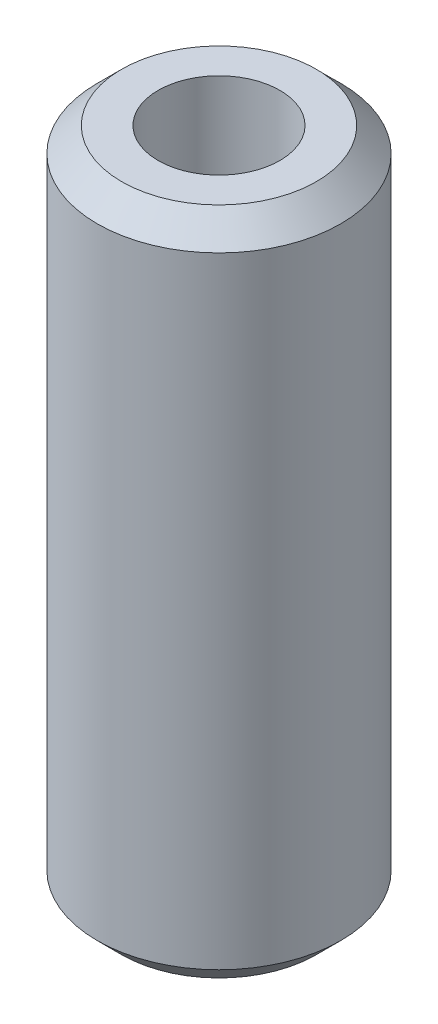
ISO-10303-21;
HEADER;
FILE_DESCRIPTION(('STEP AP214'),'2;1');
FILE_NAME('part.step','',(''),(''),'','','');
FILE_SCHEMA(('AUTOMOTIVE_DESIGN { 1 0 10303 214 1 1 1 1 }'));
ENDSEC;
DATA;
#1=APPLICATION_CONTEXT('core data for automotive mechanical design processes');
#2=APPLICATION_PROTOCOL_DEFINITION('international standard','automotive_design',2000,#1);
#3=PRODUCT_CONTEXT('',#1,'mechanical');
#4=PRODUCT('Part','Part','',(#3));
#5=PRODUCT_RELATED_PRODUCT_CATEGORY('part','',(#4));
#6=PRODUCT_DEFINITION_FORMATION('','',#4);
#7=PRODUCT_DEFINITION_CONTEXT('part definition',#1,'design');
#8=PRODUCT_DEFINITION('design','',#6,#7);
#9=PRODUCT_DEFINITION_SHAPE('','',#8);
#10=(LENGTH_UNIT() NAMED_UNIT(*) SI_UNIT(.MILLI.,.METRE.));
#11=(NAMED_UNIT(*) PLANE_ANGLE_UNIT() SI_UNIT($,.RADIAN.));
#12=(NAMED_UNIT(*) SI_UNIT($,.STERADIAN.) SOLID_ANGLE_UNIT());
#13=UNCERTAINTY_MEASURE_WITH_UNIT(LENGTH_MEASURE(1.E-05),#10,'distance_accuracy_value','');
#14=(GEOMETRIC_REPRESENTATION_CONTEXT(3) GLOBAL_UNCERTAINTY_ASSIGNED_CONTEXT((#13)) GLOBAL_UNIT_ASSIGNED_CONTEXT((#10,
#11,#12)) REPRESENTATION_CONTEXT('',''));
#15=CARTESIAN_POINT('',(0.,0.,0.));
#16=DIRECTION('',(0.,0.,1.));
#17=DIRECTION('',(1.,0.,0.));
#18=AXIS2_PLACEMENT_3D('',#15,#16,#17);
#19=CARTESIAN_POINT('',(0.,34.925,0.));
#20=DIRECTION('',(0.,1.,0.));
#21=DIRECTION('',(0.,0.,1.));
#22=AXIS2_PLACEMENT_3D('',#19,#20,#21);
#23=PLANE('',#22);
#24=CARTESIAN_POINT('',(0.,34.925,0.));
#25=DIRECTION('',(0.,1.,0.));
#26=DIRECTION('',(0.,0.,1.));
#27=AXIS2_PLACEMENT_3D('',#24,#25,#26);
#28=CIRCLE('',#27,10.16);
#29=CARTESIAN_POINT('',(0.,34.925,10.16));
#30=VERTEX_POINT('',#29);
#31=EDGE_CURVE('E10',#30,#30,#28,.T.);
#32=ORIENTED_EDGE('',*,*,#31,.T.);
#33=EDGE_LOOP('',(#32));
#34=FACE_BOUND('',#33,.T.);
#35=CARTESIAN_POINT('',(0.,34.925,0.));
#36=DIRECTION('',(0.,1.,0.));
#37=DIRECTION('',(0.,0.,1.));
#38=AXIS2_PLACEMENT_3D('',#35,#36,#37);
#39=CIRCLE('',#38,6.35);
#40=CARTESIAN_POINT('',(0.,34.925,6.35));
#41=VERTEX_POINT('',#40);
#42=EDGE_CURVE('E52',#41,#41,#39,.T.);
#43=ORIENTED_EDGE('',*,*,#42,.F.);
#44=EDGE_LOOP('',(#43));
#45=FACE_BOUND('',#44,.T.);
#46=ADVANCED_FACE('F32',(#34,#45),#23,.T.);
#47=CARTESIAN_POINT('',(0.,-34.925,0.));
#48=DIRECTION('',(0.,1.,0.));
#49=DIRECTION('',(0.,0.,1.));
#50=AXIS2_PLACEMENT_3D('',#47,#48,#49);
#51=PLANE('',#50);
#52=CARTESIAN_POINT('',(0.,-34.925,0.));
#53=DIRECTION('',(0.,1.,0.));
#54=DIRECTION('',(0.,0.,1.));
#55=AXIS2_PLACEMENT_3D('',#52,#53,#54);
#56=CIRCLE('',#55,10.16);
#57=CARTESIAN_POINT('',(0.,-34.925,10.16));
#58=VERTEX_POINT('',#57);
#59=EDGE_CURVE('E39',#58,#58,#56,.F.);
#60=ORIENTED_EDGE('',*,*,#59,.T.);
#61=EDGE_LOOP('',(#60));
#62=FACE_BOUND('',#61,.T.);
#63=CARTESIAN_POINT('',(0.,-34.925,0.));
#64=DIRECTION('',(0.,1.,0.));
#65=DIRECTION('',(0.,0.,1.));
#66=AXIS2_PLACEMENT_3D('',#63,#64,#65);
#67=CIRCLE('',#66,6.35);
#68=CARTESIAN_POINT('',(0.,-34.925,6.35));
#69=VERTEX_POINT('',#68);
#70=EDGE_CURVE('E53',#69,#69,#67,.T.);
#71=ORIENTED_EDGE('',*,*,#70,.T.);
#72=EDGE_LOOP('',(#71));
#73=FACE_BOUND('',#72,.T.);
#74=ADVANCED_FACE('F63',(#62,#73),#51,.F.);
#75=CARTESIAN_POINT('',(0.,34.925,0.));
#76=DIRECTION('',(0.,-1.,0.));
#77=DIRECTION('',(0.,0.,-1.));
#78=AXIS2_PLACEMENT_3D('',#75,#76,#77);
#79=CYLINDRICAL_SURFACE('',#78,12.7);
#80=CARTESIAN_POINT('',(0.,-32.385,0.));
#81=DIRECTION('',(0.,1.,0.));
#82=DIRECTION('',(0.,0.,1.));
#83=AXIS2_PLACEMENT_3D('',#80,#81,#82);
#84=CIRCLE('',#83,12.7);
#85=CARTESIAN_POINT('',(0.,-32.385,12.7));
#86=VERTEX_POINT('',#85);
#87=EDGE_CURVE('E43',#86,#86,#84,.T.);
#88=ORIENTED_EDGE('',*,*,#87,.T.);
#89=EDGE_LOOP('',(#88));
#90=FACE_BOUND('',#89,.T.);
#91=CARTESIAN_POINT('',(0.,32.385,0.));
#92=DIRECTION('',(0.,1.,0.));
#93=DIRECTION('',(0.,0.,1.));
#94=AXIS2_PLACEMENT_3D('',#91,#92,#93);
#95=CIRCLE('',#94,12.7);
#96=CARTESIAN_POINT('',(0.,32.385,12.7));
#97=VERTEX_POINT('',#96);
#98=EDGE_CURVE('E47',#97,#97,#95,.F.);
#99=ORIENTED_EDGE('',*,*,#98,.T.);
#100=EDGE_LOOP('',(#99));
#101=FACE_BOUND('',#100,.T.);
#102=ADVANCED_FACE('F68',(#90,#101),#79,.T.);
#103=CARTESIAN_POINT('',(0.,34.925,0.));
#104=DIRECTION('',(0.,-1.,0.));
#105=DIRECTION('',(0.,0.,-1.));
#106=AXIS2_PLACEMENT_3D('',#103,#104,#105);
#107=CYLINDRICAL_SURFACE('',#106,6.35);
#108=ORIENTED_EDGE('',*,*,#42,.T.);
#109=EDGE_LOOP('',(#108));
#110=FACE_BOUND('',#109,.T.);
#111=ORIENTED_EDGE('',*,*,#70,.F.);
#112=EDGE_LOOP('',(#111));
#113=FACE_BOUND('',#112,.T.);
#114=ADVANCED_FACE('F59',(#110,#113),#107,.F.);
#115=CARTESIAN_POINT('',(0.,-32.385,0.));
#116=DIRECTION('',(0.,1.,0.));
#117=DIRECTION('',(0.,0.,1.));
#118=AXIS2_PLACEMENT_3D('',#115,#116,#117);
#119=CONICAL_SURFACE('',#118,12.7,0.785398163397449);
#120=ORIENTED_EDGE('',*,*,#59,.F.);
#121=EDGE_LOOP('',(#120));
#122=FACE_BOUND('',#121,.T.);
#123=ORIENTED_EDGE('',*,*,#87,.F.);
#124=EDGE_LOOP('',(#123));
#125=FACE_BOUND('',#124,.T.);
#126=ADVANCED_FACE('F74',(#122,#125),#119,.T.);
#127=CARTESIAN_POINT('',(0.,34.925,0.));
#128=DIRECTION('',(0.,-1.,0.));
#129=DIRECTION('',(0.,0.,-1.));
#130=AXIS2_PLACEMENT_3D('',#127,#128,#129);
#131=CONICAL_SURFACE('',#130,10.16,0.785398163397446);
#132=ORIENTED_EDGE('',*,*,#98,.F.);
#133=EDGE_LOOP('',(#132));
#134=FACE_BOUND('',#133,.T.);
#135=ORIENTED_EDGE('',*,*,#31,.F.);
#136=EDGE_LOOP('',(#135));
#137=FACE_BOUND('',#136,.T.);
#138=ADVANCED_FACE('F34',(#134,#137),#131,.T.);
#139=CLOSED_SHELL('',(#46,#74,#102,#114,#126,#138));
#140=MANIFOLD_SOLID_BREP('B2',#139);
#141=ADVANCED_BREP_SHAPE_REPRESENTATION('',(#18,#140),#14);
#142=SHAPE_DEFINITION_REPRESENTATION(#9,#141);
ENDSEC;
END-ISO-10303-21;
